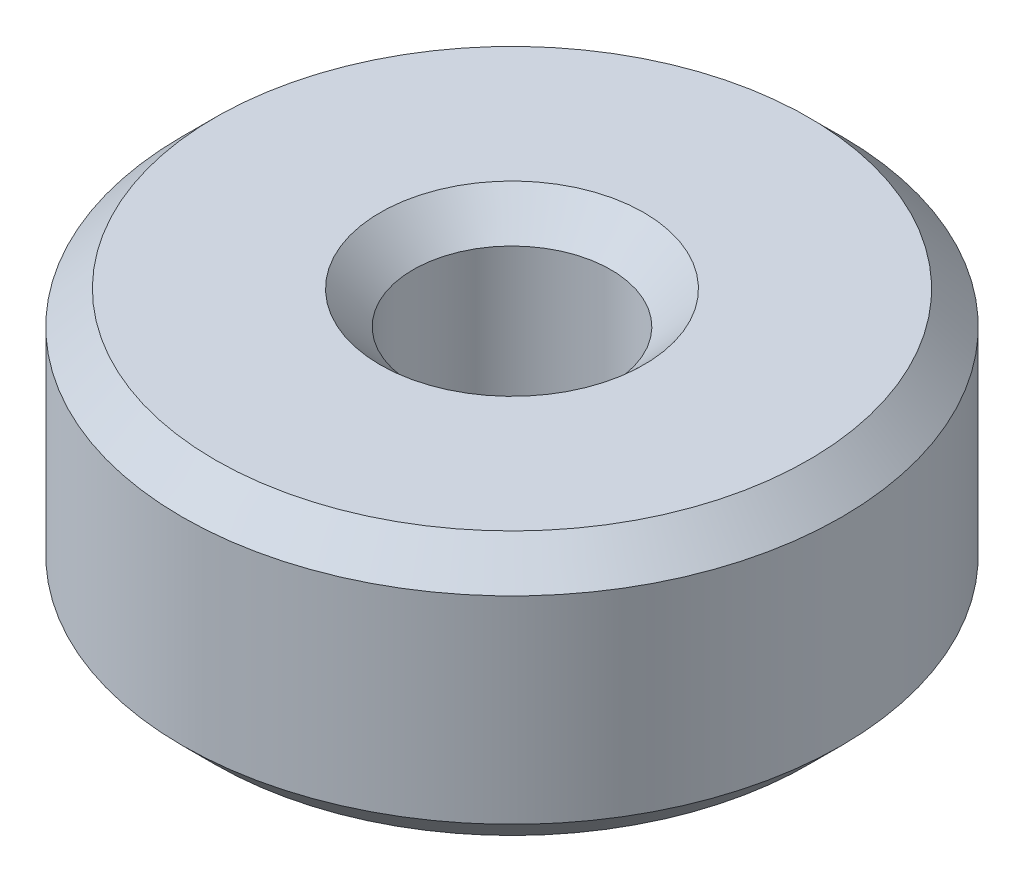
ISO-10303-21;
HEADER;
FILE_DESCRIPTION(('STEP AP214'),'2;1');
FILE_NAME('part.step','',(''),(''),'','','');
FILE_SCHEMA(('AUTOMOTIVE_DESIGN { 1 0 10303 214 1 1 1 1 }'));
ENDSEC;
DATA;
#1=APPLICATION_CONTEXT('core data for automotive mechanical design processes');
#2=APPLICATION_PROTOCOL_DEFINITION('international standard','automotive_design',2000,#1);
#3=PRODUCT_CONTEXT('',#1,'mechanical');
#4=PRODUCT('Part','Part','',(#3));
#5=PRODUCT_RELATED_PRODUCT_CATEGORY('part','',(#4));
#6=PRODUCT_DEFINITION_FORMATION('','',#4);
#7=PRODUCT_DEFINITION_CONTEXT('part definition',#1,'design');
#8=PRODUCT_DEFINITION('design','',#6,#7);
#9=PRODUCT_DEFINITION_SHAPE('','',#8);
#10=(LENGTH_UNIT() NAMED_UNIT(*) SI_UNIT(.MILLI.,.METRE.));
#11=(NAMED_UNIT(*) PLANE_ANGLE_UNIT() SI_UNIT($,.RADIAN.));
#12=(NAMED_UNIT(*) SI_UNIT($,.STERADIAN.) SOLID_ANGLE_UNIT());
#13=UNCERTAINTY_MEASURE_WITH_UNIT(LENGTH_MEASURE(1.E-05),#10,'distance_accuracy_value','');
#14=(GEOMETRIC_REPRESENTATION_CONTEXT(3) GLOBAL_UNCERTAINTY_ASSIGNED_CONTEXT((#13)) GLOBAL_UNIT_ASSIGNED_CONTEXT((#10,
#11,#12)) REPRESENTATION_CONTEXT('',''));
#15=CARTESIAN_POINT('',(0.,0.,0.));
#16=DIRECTION('',(0.,0.,1.));
#17=DIRECTION('',(1.,0.,0.));
#18=AXIS2_PLACEMENT_3D('',#15,#16,#17);
#19=CARTESIAN_POINT('',(0.,4.,0.));
#20=DIRECTION('',(0.,1.,0.));
#21=DIRECTION('',(0.,0.,1.));
#22=AXIS2_PLACEMENT_3D('',#19,#20,#21);
#23=PLANE('',#22);
#24=CARTESIAN_POINT('',(0.,4.,0.));
#25=DIRECTION('',(0.,1.,0.));
#26=DIRECTION('',(0.,0.,1.));
#27=AXIS2_PLACEMENT_3D('',#24,#25,#26);
#28=CIRCLE('',#27,4.5);
#29=CARTESIAN_POINT('',(0.,4.,4.5));
#30=VERTEX_POINT('',#29);
#31=EDGE_CURVE('E42',#30,#30,#28,.T.);
#32=ORIENTED_EDGE('',*,*,#31,.T.);
#33=EDGE_LOOP('',(#32));
#34=FACE_BOUND('',#33,.T.);
#35=CARTESIAN_POINT('',(0.,4.,0.));
#36=DIRECTION('',(0.,1.,0.));
#37=DIRECTION('',(0.,0.,1.));
#38=AXIS2_PLACEMENT_3D('',#35,#36,#37);
#39=CIRCLE('',#38,2.);
#40=CARTESIAN_POINT('',(0.,4.,2.));
#41=VERTEX_POINT('',#40);
#42=EDGE_CURVE('E46',#41,#41,#39,.F.);
#43=ORIENTED_EDGE('',*,*,#42,.T.);
#44=EDGE_LOOP('',(#43));
#45=FACE_BOUND('',#44,.T.);
#46=ADVANCED_FACE('F34',(#34,#45),#23,.T.);
#47=CARTESIAN_POINT('',(0.,0.,0.));
#48=DIRECTION('',(0.,1.,0.));
#49=DIRECTION('',(0.,0.,1.));
#50=AXIS2_PLACEMENT_3D('',#47,#48,#49);
#51=PLANE('',#50);
#52=CARTESIAN_POINT('',(0.,0.,0.));
#53=DIRECTION('',(0.,1.,0.));
#54=DIRECTION('',(0.,0.,1.));
#55=AXIS2_PLACEMENT_3D('',#52,#53,#54);
#56=CIRCLE('',#55,4.5);
#57=CARTESIAN_POINT('',(0.,0.,4.5));
#58=VERTEX_POINT('',#57);
#59=EDGE_CURVE('E50',#58,#58,#56,.F.);
#60=ORIENTED_EDGE('',*,*,#59,.T.);
#61=EDGE_LOOP('',(#60));
#62=FACE_BOUND('',#61,.T.);
#63=CARTESIAN_POINT('',(0.,0.,0.));
#64=DIRECTION('',(0.,1.,0.));
#65=DIRECTION('',(0.,0.,1.));
#66=AXIS2_PLACEMENT_3D('',#63,#64,#65);
#67=CIRCLE('',#66,1.5);
#68=CARTESIAN_POINT('',(0.,0.,1.5));
#69=VERTEX_POINT('',#68);
#70=EDGE_CURVE('E61',#69,#69,#67,.T.);
#71=ORIENTED_EDGE('',*,*,#70,.T.);
#72=EDGE_LOOP('',(#71));
#73=FACE_BOUND('',#72,.T.);
#74=ADVANCED_FACE('F65',(#62,#73),#51,.F.);
#75=CARTESIAN_POINT('',(0.,4.,0.));
#76=DIRECTION('',(0.,-1.,0.));
#77=DIRECTION('',(0.,0.,-1.));
#78=AXIS2_PLACEMENT_3D('',#75,#76,#77);
#79=CYLINDRICAL_SURFACE('',#78,5.);
#80=CARTESIAN_POINT('',(0.,0.499999999999999,0.));
#81=DIRECTION('',(0.,1.,0.));
#82=DIRECTION('',(0.,0.,1.));
#83=AXIS2_PLACEMENT_3D('',#80,#81,#82);
#84=CIRCLE('',#83,5.);
#85=CARTESIAN_POINT('',(0.,0.499999999999999,5.));
#86=VERTEX_POINT('',#85);
#87=EDGE_CURVE('E55',#86,#86,#84,.T.);
#88=ORIENTED_EDGE('',*,*,#87,.T.);
#89=EDGE_LOOP('',(#88));
#90=FACE_BOUND('',#89,.T.);
#91=CARTESIAN_POINT('',(0.,3.5,0.));
#92=DIRECTION('',(0.,1.,0.));
#93=DIRECTION('',(0.,0.,1.));
#94=AXIS2_PLACEMENT_3D('',#91,#92,#93);
#95=CIRCLE('',#94,5.);
#96=CARTESIAN_POINT('',(0.,3.5,5.));
#97=VERTEX_POINT('',#96);
#98=EDGE_CURVE('E58',#97,#97,#95,.F.);
#99=ORIENTED_EDGE('',*,*,#98,.T.);
#100=EDGE_LOOP('',(#99));
#101=FACE_BOUND('',#100,.T.);
#102=ADVANCED_FACE('F70',(#90,#101),#79,.T.);
#103=CARTESIAN_POINT('',(0.,4.,0.));
#104=DIRECTION('',(0.,-1.,0.));
#105=DIRECTION('',(0.,0.,-1.));
#106=AXIS2_PLACEMENT_3D('',#103,#104,#105);
#107=CYLINDRICAL_SURFACE('',#106,1.5);
#108=CARTESIAN_POINT('',(0.,3.5,0.));
#109=DIRECTION('',(0.,1.,0.));
#110=DIRECTION('',(0.,0.,1.));
#111=AXIS2_PLACEMENT_3D('',#108,#109,#110);
#112=CIRCLE('',#111,1.5);
#113=CARTESIAN_POINT('',(0.,3.5,1.5));
#114=VERTEX_POINT('',#113);
#115=EDGE_CURVE('E10',#114,#114,#112,.T.);
#116=ORIENTED_EDGE('',*,*,#115,.T.);
#117=EDGE_LOOP('',(#116));
#118=FACE_BOUND('',#117,.T.);
#119=ORIENTED_EDGE('',*,*,#70,.F.);
#120=EDGE_LOOP('',(#119));
#121=FACE_BOUND('',#120,.T.);
#122=ADVANCED_FACE('F67',(#118,#121),#107,.F.);
#123=CARTESIAN_POINT('',(0.,0.499999999999999,0.));
#124=DIRECTION('',(0.,1.,0.));
#125=DIRECTION('',(0.,0.,1.));
#126=AXIS2_PLACEMENT_3D('',#123,#124,#125);
#127=CONICAL_SURFACE('',#126,5.,0.785398163397449);
#128=ORIENTED_EDGE('',*,*,#59,.F.);
#129=EDGE_LOOP('',(#128));
#130=FACE_BOUND('',#129,.T.);
#131=ORIENTED_EDGE('',*,*,#87,.F.);
#132=EDGE_LOOP('',(#131));
#133=FACE_BOUND('',#132,.T.);
#134=ADVANCED_FACE('F69',(#130,#133),#127,.T.);
#135=CARTESIAN_POINT('',(0.,4.,0.));
#136=DIRECTION('',(0.,-1.,0.));
#137=DIRECTION('',(0.,0.,-1.));
#138=AXIS2_PLACEMENT_3D('',#135,#136,#137);
#139=CONICAL_SURFACE('',#138,4.5,0.785398163397447);
#140=ORIENTED_EDGE('',*,*,#98,.F.);
#141=EDGE_LOOP('',(#140));
#142=FACE_BOUND('',#141,.T.);
#143=ORIENTED_EDGE('',*,*,#31,.F.);
#144=EDGE_LOOP('',(#143));
#145=FACE_BOUND('',#144,.T.);
#146=ADVANCED_FACE('F76',(#142,#145),#139,.T.);
#147=CARTESIAN_POINT('',(0.,3.5,0.));
#148=DIRECTION('',(0.,1.,0.));
#149=DIRECTION('',(0.,0.,1.));
#150=AXIS2_PLACEMENT_3D('',#147,#148,#149);
#151=CONICAL_SURFACE('',#150,1.5,0.78539816339745);
#152=ORIENTED_EDGE('',*,*,#42,.F.);
#153=EDGE_LOOP('',(#152));
#154=FACE_BOUND('',#153,.T.);
#155=ORIENTED_EDGE('',*,*,#115,.F.);
#156=EDGE_LOOP('',(#155));
#157=FACE_BOUND('',#156,.T.);
#158=ADVANCED_FACE('F37',(#154,#157),#151,.F.);
#159=CLOSED_SHELL('',(#46,#74,#102,#122,#134,#146,#158));
#160=MANIFOLD_SOLID_BREP('B2',#159);
#161=ADVANCED_BREP_SHAPE_REPRESENTATION('',(#18,#160),#14);
#162=SHAPE_DEFINITION_REPRESENTATION(#9,#161);
ENDSEC;
END-ISO-10303-21;
